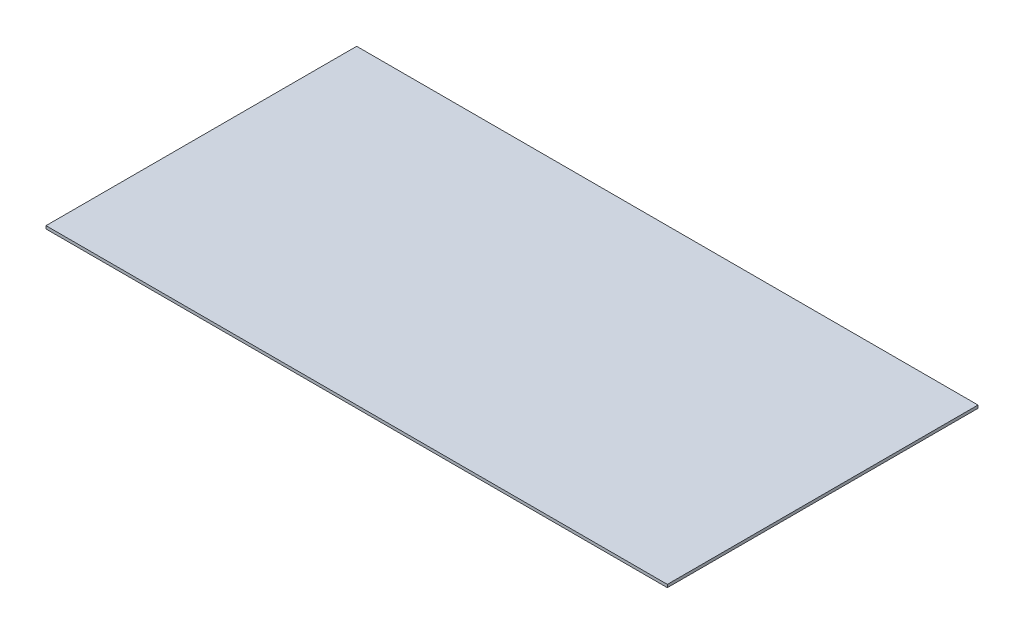
ISO-10303-21;
HEADER;
FILE_DESCRIPTION(('STEP AP214'),'2;1');
FILE_NAME('part.step','',(''),(''),'','','');
FILE_SCHEMA(('AUTOMOTIVE_DESIGN { 1 0 10303 214 1 1 1 1 }'));
ENDSEC;
DATA;
#1=APPLICATION_CONTEXT('core data for automotive mechanical design processes');
#2=APPLICATION_PROTOCOL_DEFINITION('international standard','automotive_design',2000,#1);
#3=PRODUCT_CONTEXT('',#1,'mechanical');
#4=PRODUCT('Part','Part','',(#3));
#5=PRODUCT_RELATED_PRODUCT_CATEGORY('part','',(#4));
#6=PRODUCT_DEFINITION_FORMATION('','',#4);
#7=PRODUCT_DEFINITION_CONTEXT('part definition',#1,'design');
#8=PRODUCT_DEFINITION('design','',#6,#7);
#9=PRODUCT_DEFINITION_SHAPE('','',#8);
#10=(LENGTH_UNIT() NAMED_UNIT(*) SI_UNIT(.MILLI.,.METRE.));
#11=(NAMED_UNIT(*) PLANE_ANGLE_UNIT() SI_UNIT($,.RADIAN.));
#12=(NAMED_UNIT(*) SI_UNIT($,.STERADIAN.) SOLID_ANGLE_UNIT());
#13=UNCERTAINTY_MEASURE_WITH_UNIT(LENGTH_MEASURE(1.E-05),#10,'distance_accuracy_value','');
#14=(GEOMETRIC_REPRESENTATION_CONTEXT(3) GLOBAL_UNCERTAINTY_ASSIGNED_CONTEXT((#13)) GLOBAL_UNIT_ASSIGNED_CONTEXT((#10,
#11,#12)) REPRESENTATION_CONTEXT('',''));
#15=CARTESIAN_POINT('',(0.,0.,0.));
#16=DIRECTION('',(0.,0.,1.));
#17=DIRECTION('',(1.,0.,0.));
#18=AXIS2_PLACEMENT_3D('',#15,#16,#17);
#19=CARTESIAN_POINT('',(45.,0.42,22.5));
#20=DIRECTION('',(-1.,0.,0.));
#21=DIRECTION('',(0.,0.,1.));
#22=AXIS2_PLACEMENT_3D('',#19,#20,#21);
#23=PLANE('',#22);
#24=DIRECTION('',(0.,0.,-1.));
#25=VECTOR('',#24,1.);
#26=CARTESIAN_POINT('',(45.,0.,22.5));
#27=LINE('',#26,#25);
#28=CARTESIAN_POINT('',(45.,0.,22.5));
#29=VERTEX_POINT('',#28);
#30=CARTESIAN_POINT('',(45.,0.,-22.5));
#31=VERTEX_POINT('',#30);
#32=EDGE_CURVE('E107',#29,#31,#27,.T.);
#33=ORIENTED_EDGE('',*,*,#32,.T.);
#34=DIRECTION('',(0.,-1.,0.));
#35=VECTOR('',#34,1.);
#36=CARTESIAN_POINT('',(45.,0.42,-22.5));
#37=LINE('',#36,#35);
#38=CARTESIAN_POINT('',(45.,0.42,-22.5));
#39=VERTEX_POINT('',#38);
#40=EDGE_CURVE('E11',#39,#31,#37,.T.);
#41=ORIENTED_EDGE('',*,*,#40,.F.);
#42=DIRECTION('',(0.,0.,-1.));
#43=VECTOR('',#42,1.);
#44=CARTESIAN_POINT('',(45.,0.42,22.5));
#45=LINE('',#44,#43);
#46=CARTESIAN_POINT('',(45.,0.42,22.5));
#47=VERTEX_POINT('',#46);
#48=EDGE_CURVE('E91',#47,#39,#45,.T.);
#49=ORIENTED_EDGE('',*,*,#48,.F.);
#50=DIRECTION('',(0.,-1.,0.));
#51=VECTOR('',#50,1.);
#52=CARTESIAN_POINT('',(45.,0.42,22.5));
#53=LINE('',#52,#51);
#54=EDGE_CURVE('E103',#47,#29,#53,.T.);
#55=ORIENTED_EDGE('',*,*,#54,.T.);
#56=EDGE_LOOP('',(#33,#41,#49,#55));
#57=FACE_BOUND('',#56,.T.);
#58=ADVANCED_FACE('F39',(#57),#23,.F.);
#59=CARTESIAN_POINT('',(-45.,0.42,-22.5));
#60=DIRECTION('',(0.,0.,1.));
#61=DIRECTION('',(1.,0.,0.));
#62=AXIS2_PLACEMENT_3D('',#59,#60,#61);
#63=PLANE('',#62);
#64=DIRECTION('',(-1.,0.,0.));
#65=VECTOR('',#64,1.);
#66=CARTESIAN_POINT('',(-45.,0.,-22.5));
#67=LINE('',#66,#65);
#68=CARTESIAN_POINT('',(-45.,0.,-22.5));
#69=VERTEX_POINT('',#68);
#70=EDGE_CURVE('E96',#31,#69,#67,.T.);
#71=ORIENTED_EDGE('',*,*,#70,.T.);
#72=DIRECTION('',(0.,-1.,0.));
#73=VECTOR('',#72,1.);
#74=CARTESIAN_POINT('',(-45.,0.42,-22.5));
#75=LINE('',#74,#73);
#76=CARTESIAN_POINT('',(-45.,0.42,-22.5));
#77=VERTEX_POINT('',#76);
#78=EDGE_CURVE('E48',#77,#69,#75,.T.);
#79=ORIENTED_EDGE('',*,*,#78,.F.);
#80=DIRECTION('',(-1.,0.,0.));
#81=VECTOR('',#80,1.);
#82=CARTESIAN_POINT('',(-45.,0.42,-22.5));
#83=LINE('',#82,#81);
#84=EDGE_CURVE('E86',#39,#77,#83,.T.);
#85=ORIENTED_EDGE('',*,*,#84,.F.);
#86=ORIENTED_EDGE('',*,*,#40,.T.);
#87=EDGE_LOOP('',(#71,#79,#85,#86));
#88=FACE_BOUND('',#87,.T.);
#89=ADVANCED_FACE('F95',(#88),#63,.F.);
#90=CARTESIAN_POINT('',(-45.,0.42,22.5));
#91=DIRECTION('',(1.,0.,0.));
#92=DIRECTION('',(0.,0.,-1.));
#93=AXIS2_PLACEMENT_3D('',#90,#91,#92);
#94=PLANE('',#93);
#95=DIRECTION('',(0.,0.,1.));
#96=VECTOR('',#95,1.);
#97=CARTESIAN_POINT('',(-45.,0.,22.5));
#98=LINE('',#97,#96);
#99=CARTESIAN_POINT('',(-45.,0.,22.5));
#100=VERTEX_POINT('',#99);
#101=EDGE_CURVE('E73',#69,#100,#98,.T.);
#102=ORIENTED_EDGE('',*,*,#101,.T.);
#103=DIRECTION('',(0.,-1.,0.));
#104=VECTOR('',#103,1.);
#105=CARTESIAN_POINT('',(-45.,0.42,22.5));
#106=LINE('',#105,#104);
#107=CARTESIAN_POINT('',(-45.,0.42,22.5));
#108=VERTEX_POINT('',#107);
#109=EDGE_CURVE('E98',#108,#100,#106,.T.);
#110=ORIENTED_EDGE('',*,*,#109,.F.);
#111=DIRECTION('',(0.,0.,1.));
#112=VECTOR('',#111,1.);
#113=CARTESIAN_POINT('',(-45.,0.42,22.5));
#114=LINE('',#113,#112);
#115=EDGE_CURVE('E89',#77,#108,#114,.T.);
#116=ORIENTED_EDGE('',*,*,#115,.F.);
#117=ORIENTED_EDGE('',*,*,#78,.T.);
#118=EDGE_LOOP('',(#102,#110,#116,#117));
#119=FACE_BOUND('',#118,.T.);
#120=ADVANCED_FACE('F99',(#119),#94,.F.);
#121=CARTESIAN_POINT('',(-45.,0.42,22.5));
#122=DIRECTION('',(0.,0.,-1.));
#123=DIRECTION('',(-1.,0.,0.));
#124=AXIS2_PLACEMENT_3D('',#121,#122,#123);
#125=PLANE('',#124);
#126=DIRECTION('',(1.,0.,0.));
#127=VECTOR('',#126,1.);
#128=CARTESIAN_POINT('',(-45.,0.,22.5));
#129=LINE('',#128,#127);
#130=EDGE_CURVE('E79',#100,#29,#129,.T.);
#131=ORIENTED_EDGE('',*,*,#130,.T.);
#132=ORIENTED_EDGE('',*,*,#54,.F.);
#133=DIRECTION('',(1.,0.,0.));
#134=VECTOR('',#133,1.);
#135=CARTESIAN_POINT('',(-45.,0.42,22.5));
#136=LINE('',#135,#134);
#137=EDGE_CURVE('E56',#108,#47,#136,.T.);
#138=ORIENTED_EDGE('',*,*,#137,.F.);
#139=ORIENTED_EDGE('',*,*,#109,.T.);
#140=EDGE_LOOP('',(#131,#132,#138,#139));
#141=FACE_BOUND('',#140,.T.);
#142=ADVANCED_FACE('F120',(#141),#125,.F.);
#143=CARTESIAN_POINT('',(0.,0.42,0.));
#144=DIRECTION('',(0.,-1.,0.));
#145=DIRECTION('',(0.,0.,-1.));
#146=AXIS2_PLACEMENT_3D('',#143,#144,#145);
#147=PLANE('',#146);
#148=ORIENTED_EDGE('',*,*,#48,.T.);
#149=ORIENTED_EDGE('',*,*,#84,.T.);
#150=ORIENTED_EDGE('',*,*,#115,.T.);
#151=ORIENTED_EDGE('',*,*,#137,.T.);
#152=EDGE_LOOP('',(#148,#149,#150,#151));
#153=FACE_BOUND('',#152,.T.);
#154=ADVANCED_FACE('F87',(#153),#147,.F.);
#155=CARTESIAN_POINT('',(0.,0.,0.));
#156=DIRECTION('',(0.,-1.,0.));
#157=DIRECTION('',(0.,0.,-1.));
#158=AXIS2_PLACEMENT_3D('',#155,#156,#157);
#159=PLANE('',#158);
#160=ORIENTED_EDGE('',*,*,#32,.F.);
#161=ORIENTED_EDGE('',*,*,#130,.F.);
#162=ORIENTED_EDGE('',*,*,#101,.F.);
#163=ORIENTED_EDGE('',*,*,#70,.F.);
#164=EDGE_LOOP('',(#160,#161,#162,#163));
#165=FACE_BOUND('',#164,.T.);
#166=ADVANCED_FACE('F123',(#165),#159,.T.);
#167=CLOSED_SHELL('',(#58,#89,#120,#142,#154,#166));
#168=MANIFOLD_SOLID_BREP('B2',#167);
#169=ADVANCED_BREP_SHAPE_REPRESENTATION('',(#18,#168),#14);
#170=SHAPE_DEFINITION_REPRESENTATION(#9,#169);
ENDSEC;
END-ISO-10303-21;
